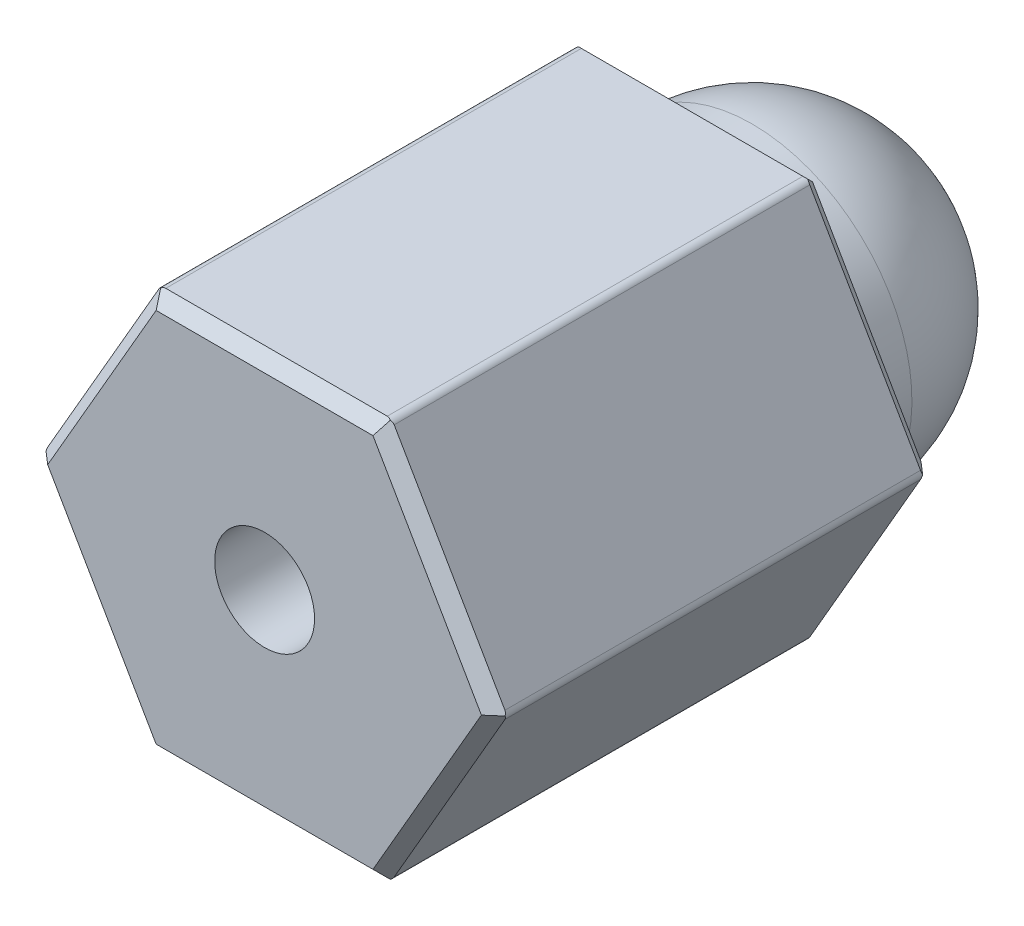
ISO-10303-21;
HEADER;
FILE_DESCRIPTION(('STEP AP214'),'2;1');
FILE_NAME('part.step','',(''),(''),'','','');
FILE_SCHEMA(('AUTOMOTIVE_DESIGN { 1 0 10303 214 1 1 1 1 }'));
ENDSEC;
DATA;
#1=APPLICATION_CONTEXT('core data for automotive mechanical design processes');
#2=APPLICATION_PROTOCOL_DEFINITION('international standard','automotive_design',2000,#1);
#3=PRODUCT_CONTEXT('',#1,'mechanical');
#4=PRODUCT('Part','Part','',(#3));
#5=PRODUCT_RELATED_PRODUCT_CATEGORY('part','',(#4));
#6=PRODUCT_DEFINITION_FORMATION('','',#4);
#7=PRODUCT_DEFINITION_CONTEXT('part definition',#1,'design');
#8=PRODUCT_DEFINITION('design','',#6,#7);
#9=PRODUCT_DEFINITION_SHAPE('','',#8);
#10=(LENGTH_UNIT() NAMED_UNIT(*) SI_UNIT(.MILLI.,.METRE.));
#11=(NAMED_UNIT(*) PLANE_ANGLE_UNIT() SI_UNIT($,.RADIAN.));
#12=(NAMED_UNIT(*) SI_UNIT($,.STERADIAN.) SOLID_ANGLE_UNIT());
#13=UNCERTAINTY_MEASURE_WITH_UNIT(LENGTH_MEASURE(1.E-05),#10,'distance_accuracy_value','');
#14=(GEOMETRIC_REPRESENTATION_CONTEXT(3) GLOBAL_UNCERTAINTY_ASSIGNED_CONTEXT((#13)) GLOBAL_UNIT_ASSIGNED_CONTEXT((#10,
#11,#12)) REPRESENTATION_CONTEXT('',''));
#15=CARTESIAN_POINT('',(0.,0.,0.));
#16=DIRECTION('',(0.,0.,1.));
#17=DIRECTION('',(1.,0.,0.));
#18=AXIS2_PLACEMENT_3D('',#15,#16,#17);
#19=CARTESIAN_POINT('',(-2.888502691896,-5.,-5.5));
#20=DIRECTION('',(0.,-1.,0.));
#21=DIRECTION('',(0.,0.,-1.));
#22=AXIS2_PLACEMENT_3D('',#19,#20,#21);
#23=PLANE('',#22);
#24=DIRECTION('',(1.,0.,0.));
#25=VECTOR('',#24,1.);
#26=CARTESIAN_POINT('',(-2.773032638058,-5.,5.2));
#27=LINE('',#26,#25);
#28=CARTESIAN_POINT('',(-2.773032638058,-5.,5.2));
#29=VERTEX_POINT('',#28);
#30=CARTESIAN_POINT('',(2.769529946162,-5.,5.2));
#31=VERTEX_POINT('',#30);
#32=EDGE_CURVE('E280',#29,#31,#27,.T.);
#33=ORIENTED_EDGE('',*,*,#32,.F.);
#34=DIRECTION('',(0.,0.,-1.));
#35=VECTOR('',#34,1.);
#36=CARTESIAN_POINT('',(-2.773032638058,-5.,5.2));
#37=LINE('',#36,#35);
#38=CARTESIAN_POINT('',(-2.773032638058,-5.,-5.2));
#39=VERTEX_POINT('',#38);
#40=EDGE_CURVE('E514',#29,#39,#37,.T.);
#41=ORIENTED_EDGE('',*,*,#40,.T.);
#42=DIRECTION('',(-1.,0.,0.));
#43=VECTOR('',#42,1.);
#44=CARTESIAN_POINT('',(2.769529946162,-5.,-5.2));
#45=LINE('',#44,#43);
#46=CARTESIAN_POINT('',(2.769529946162,-5.,-5.2));
#47=VERTEX_POINT('',#46);
#48=EDGE_CURVE('E353',#47,#39,#45,.T.);
#49=ORIENTED_EDGE('',*,*,#48,.F.);
#50=DIRECTION('',(0.,0.,-1.));
#51=VECTOR('',#50,1.);
#52=CARTESIAN_POINT('',(2.769529946162,-5.,5.2));
#53=LINE('',#52,#51);
#54=EDGE_CURVE('E284',#31,#47,#53,.T.);
#55=ORIENTED_EDGE('',*,*,#54,.F.);
#56=EDGE_LOOP('',(#33,#41,#49,#55));
#57=FACE_BOUND('',#56,.T.);
#58=ADVANCED_FACE('F17',(#57),#23,.T.);
#59=CARTESIAN_POINT('',(2.885,-5.,-5.5));
#60=DIRECTION('',(0.866025403784429,-0.500000000000017,0.));
#61=DIRECTION('',(0.,0.,-1.));
#62=AXIS2_PLACEMENT_3D('',#59,#60,#61);
#63=PLANE('',#62);
#64=DIRECTION('',(0.500000000000017,0.866025403784429,0.));
#65=VECTOR('',#64,1.);
#66=CARTESIAN_POINT('',(2.942735026919,-4.9,5.2));
#67=LINE('',#66,#65);
#68=CARTESIAN_POINT('',(2.942735026919,-4.9,5.2));
#69=VERTEX_POINT('',#68);
#70=CARTESIAN_POINT('',(5.714016319029,-0.1,5.2));
#71=VERTEX_POINT('',#70);
#72=EDGE_CURVE('E296',#69,#71,#67,.T.);
#73=ORIENTED_EDGE('',*,*,#72,.F.);
#74=DIRECTION('',(0.,0.,-1.));
#75=VECTOR('',#74,1.);
#76=CARTESIAN_POINT('',(2.942735026919,-4.9,5.2));
#77=LINE('',#76,#75);
#78=CARTESIAN_POINT('',(2.942735026919,-4.9,-5.2));
#79=VERTEX_POINT('',#78);
#80=EDGE_CURVE('E360',#69,#79,#77,.T.);
#81=ORIENTED_EDGE('',*,*,#80,.T.);
#82=DIRECTION('',(-0.500000000000017,-0.866025403784429,0.));
#83=VECTOR('',#82,1.);
#84=CARTESIAN_POINT('',(5.714016319029,-0.1,-5.2));
#85=LINE('',#84,#83);
#86=CARTESIAN_POINT('',(5.714016319029,-0.1,-5.2));
#87=VERTEX_POINT('',#86);
#88=EDGE_CURVE('E413',#87,#79,#85,.T.);
#89=ORIENTED_EDGE('',*,*,#88,.F.);
#90=DIRECTION('',(0.,0.,-1.));
#91=VECTOR('',#90,1.);
#92=CARTESIAN_POINT('',(5.714016319029,-0.1,5.2));
#93=LINE('',#92,#91);
#94=EDGE_CURVE('E292',#71,#87,#93,.T.);
#95=ORIENTED_EDGE('',*,*,#94,.F.);
#96=EDGE_LOOP('',(#73,#81,#89,#95));
#97=FACE_BOUND('',#96,.T.);
#98=ADVANCED_FACE('F977',(#97),#63,.T.);
#99=CARTESIAN_POINT('',(5.771751345948,0.,-5.5));
#100=DIRECTION('',(0.866025403784429,0.500000000000017,0.));
#101=DIRECTION('',(0.,0.,-1.));
#102=AXIS2_PLACEMENT_3D('',#99,#100,#101);
#103=PLANE('',#102);
#104=DIRECTION('',(-0.500000000000017,0.866025403784429,0.));
#105=VECTOR('',#104,1.);
#106=CARTESIAN_POINT('',(5.714016319029,0.1,5.2));
#107=LINE('',#106,#105);
#108=CARTESIAN_POINT('',(5.714016319029,0.1,5.2));
#109=VERTEX_POINT('',#108);
#110=CARTESIAN_POINT('',(2.942735026919,4.9,5.2));
#111=VERTEX_POINT('',#110);
#112=EDGE_CURVE('E233',#109,#111,#107,.T.);
#113=ORIENTED_EDGE('',*,*,#112,.F.);
#114=DIRECTION('',(0.,0.,-1.));
#115=VECTOR('',#114,1.);
#116=CARTESIAN_POINT('',(5.714016319029,0.1,5.2));
#117=LINE('',#116,#115);
#118=CARTESIAN_POINT('',(5.714016319029,0.1,-5.2));
#119=VERTEX_POINT('',#118);
#120=EDGE_CURVE('E237',#109,#119,#117,.T.);
#121=ORIENTED_EDGE('',*,*,#120,.T.);
#122=DIRECTION('',(0.500000000000017,-0.866025403784429,0.));
#123=VECTOR('',#122,1.);
#124=CARTESIAN_POINT('',(2.942735026919,4.9,-5.2));
#125=LINE('',#124,#123);
#126=CARTESIAN_POINT('',(2.942735026919,4.9,-5.2));
#127=VERTEX_POINT('',#126);
#128=EDGE_CURVE('E374',#127,#119,#125,.T.);
#129=ORIENTED_EDGE('',*,*,#128,.F.);
#130=DIRECTION('',(0.,0.,-1.));
#131=VECTOR('',#130,1.);
#132=CARTESIAN_POINT('',(2.942735026919,4.9,5.2));
#133=LINE('',#132,#131);
#134=EDGE_CURVE('E240',#111,#127,#133,.T.);
#135=ORIENTED_EDGE('',*,*,#134,.F.);
#136=EDGE_LOOP('',(#113,#121,#129,#135));
#137=FACE_BOUND('',#136,.T.);
#138=ADVANCED_FACE('F235',(#137),#103,.T.);
#139=CARTESIAN_POINT('',(-4.201974554303,2.425,-5.35));
#140=DIRECTION('',(-0.612372435695813,0.353553390593307,-0.707106781186515));
#141=DIRECTION('',(-0.75592894601843,0.,0.654653670708006));
#142=AXIS2_PLACEMENT_3D('',#139,#140,#141);
#143=PLANE('',#142);
#144=CARTESIAN_POINT('',(-2.773032638058,4.8,-5.40000000000051));
#145=DIRECTION('',(0.612372435695813,-0.353553390593307,0.707106781186515));
#146=DIRECTION('',(-0.612372435695759,0.353553390593269,0.70710678118658));
#147=AXIS2_PLACEMENT_3D('',#144,#145,#146);
#148=ELLIPSE('',#147,0.282842712474632,0.2);
#149=CARTESIAN_POINT('',(-2.873032638058,4.973205080757,-5.226794919243));
#150=VERTEX_POINT('',#149);
#151=CARTESIAN_POINT('',(-2.946237718815,4.9,-5.2));
#152=VERTEX_POINT('',#151);
#153=EDGE_CURVE('E275',#150,#152,#148,.T.);
#154=ORIENTED_EDGE('',*,*,#153,.F.);
#155=DIRECTION('',(0.377964473009193,-0.654653670707987,-0.654653670707987));
#156=VECTOR('',#155,1.);
#157=CARTESIAN_POINT('',(-2.873032638058,4.973205080757,-5.226794919243));
#158=LINE('',#157,#156);
#159=CARTESIAN_POINT('',(-2.715297611139,4.7,-5.5));
#160=VERTEX_POINT('',#159);
#161=EDGE_CURVE('E373',#150,#160,#158,.T.);
#162=ORIENTED_EDGE('',*,*,#161,.T.);
#163=DIRECTION('',(0.500000000000017,0.866025403784429,0.));
#164=VECTOR('',#163,1.);
#165=CARTESIAN_POINT('',(-5.428843876331,0.,-5.5));
#166=LINE('',#165,#164);
#167=CARTESIAN_POINT('',(-5.428843876331,0.,-5.5));
#168=VERTEX_POINT('',#167);
#169=EDGE_CURVE('E316',#168,#160,#166,.T.);
#170=ORIENTED_EDGE('',*,*,#169,.F.);
#171=DIRECTION('',(0.755928946018463,0.,-0.654653670707968));
#172=VECTOR('',#171,1.);
#173=CARTESIAN_POINT('',(-5.744313930169,0.,-5.226794919243));
#174=LINE('',#173,#172);
#175=CARTESIAN_POINT('',(-5.744313930169,0.,-5.226794919243));
#176=VERTEX_POINT('',#175);
#177=EDGE_CURVE('E383',#176,#168,#174,.T.);
#178=ORIENTED_EDGE('',*,*,#177,.F.);
#179=CARTESIAN_POINT('',(-5.544313930169,0.,-5.4));
#180=DIRECTION('',(0.612372435695813,-0.353553390593307,0.707106781186515));
#181=DIRECTION('',(-0.612372435695756,0.353553390593275,0.70710678118658));
#182=AXIS2_PLACEMENT_3D('',#179,#180,#181);
#183=ELLIPSE('',#182,0.282842712474632,0.2);
#184=CARTESIAN_POINT('',(-5.717519010925,0.1,-5.2));
#185=VERTEX_POINT('',#184);
#186=EDGE_CURVE('E466',#185,#176,#183,.T.);
#187=ORIENTED_EDGE('',*,*,#186,.F.);
#188=DIRECTION('',(0.500000000000017,0.866025403784429,0.));
#189=VECTOR('',#188,1.);
#190=CARTESIAN_POINT('',(-5.717519010925,0.1,-5.2));
#191=LINE('',#190,#189);
#192=EDGE_CURVE('E11',#185,#152,#191,.T.);
#193=ORIENTED_EDGE('',*,*,#192,.T.);
#194=EDGE_LOOP('',(#154,#162,#170,#178,#187,#193));
#195=FACE_BOUND('',#194,.T.);
#196=ADVANCED_FACE('F946',(#195),#143,.T.);
#197=CARTESIAN_POINT('',(-2.888502691896,5.,-5.5));
#198=DIRECTION('',(-0.866025403784429,0.500000000000017,0.));
#199=DIRECTION('',(0.,0.,1.));
#200=AXIS2_PLACEMENT_3D('',#197,#198,#199);
#201=PLANE('',#200);
#202=DIRECTION('',(-0.500000000000017,-0.866025403784429,0.));
#203=VECTOR('',#202,1.);
#204=CARTESIAN_POINT('',(-2.946237718815,4.9,5.2));
#205=LINE('',#204,#203);
#206=CARTESIAN_POINT('',(-2.946237718815,4.9,5.2));
#207=VERTEX_POINT('',#206);
#208=CARTESIAN_POINT('',(-5.717519010925,0.1,5.2));
#209=VERTEX_POINT('',#208);
#210=EDGE_CURVE('E433',#207,#209,#205,.T.);
#211=ORIENTED_EDGE('',*,*,#210,.F.);
#212=DIRECTION('',(0.,0.,-1.));
#213=VECTOR('',#212,1.);
#214=CARTESIAN_POINT('',(-2.946237718815,4.9,5.2));
#215=LINE('',#214,#213);
#216=EDGE_CURVE('E28',#207,#152,#215,.T.);
#217=ORIENTED_EDGE('',*,*,#216,.T.);
#218=ORIENTED_EDGE('',*,*,#192,.F.);
#219=DIRECTION('',(0.,0.,-1.));
#220=VECTOR('',#219,1.);
#221=CARTESIAN_POINT('',(-5.717519010925,0.1,5.2));
#222=LINE('',#221,#220);
#223=EDGE_CURVE('E442',#209,#185,#222,.T.);
#224=ORIENTED_EDGE('',*,*,#223,.F.);
#225=EDGE_LOOP('',(#211,#217,#218,#224));
#226=FACE_BOUND('',#225,.T.);
#227=ADVANCED_FACE('F877',(#226),#201,.T.);
#228=CARTESIAN_POINT('',(-2.773032638058,4.8,26.35717116565));
#229=DIRECTION('',(0.,0.,-1.));
#230=DIRECTION('',(-0.866025403784429,0.500000000000017,0.));
#231=AXIS2_PLACEMENT_3D('',#228,#229,#230);
#232=CYLINDRICAL_SURFACE('',#231,0.2);
#233=CARTESIAN_POINT('',(-2.773032638058,4.8,5.4));
#234=DIRECTION('',(0.,-0.707106781186548,-0.707106781186548));
#235=DIRECTION('',(0.,0.707106781186548,-0.707106781186548));
#236=AXIS2_PLACEMENT_3D('',#233,#234,#235);
#237=ELLIPSE('',#236,0.282842712474619,0.2);
#238=CARTESIAN_POINT('',(-2.873032638058,4.973205080757,5.226794919243));
#239=VERTEX_POINT('',#238);
#240=CARTESIAN_POINT('',(-2.773032638058,5.,5.2));
#241=VERTEX_POINT('',#240);
#242=EDGE_CURVE('E335',#239,#241,#237,.T.);
#243=ORIENTED_EDGE('',*,*,#242,.T.);
#244=DIRECTION('',(0.,0.,-1.));
#245=VECTOR('',#244,1.);
#246=CARTESIAN_POINT('',(-2.773032638058,5.,5.2));
#247=LINE('',#246,#245);
#248=CARTESIAN_POINT('',(-2.773032638058,5.,-5.2));
#249=VERTEX_POINT('',#248);
#250=EDGE_CURVE('E279',#241,#249,#247,.T.);
#251=ORIENTED_EDGE('',*,*,#250,.T.);
#252=CARTESIAN_POINT('',(-2.773032638058,4.8,-5.4));
#253=DIRECTION('',(0.,-0.707106781186548,0.707106781186548));
#254=DIRECTION('',(0.,0.707106781186548,0.707106781186548));
#255=AXIS2_PLACEMENT_3D('',#252,#253,#254);
#256=ELLIPSE('',#255,0.282842712474619,0.2);
#257=EDGE_CURVE('E339',#249,#150,#256,.T.);
#258=ORIENTED_EDGE('',*,*,#257,.T.);
#259=ORIENTED_EDGE('',*,*,#153,.T.);
#260=ORIENTED_EDGE('',*,*,#216,.F.);
#261=CARTESIAN_POINT('',(-2.773032638058,4.8,5.40000000000052));
#262=DIRECTION('',(0.612372435695813,-0.353553390593307,-0.707106781186515));
#263=DIRECTION('',(-0.612372435695759,0.353553390593269,-0.70710678118658));
#264=AXIS2_PLACEMENT_3D('',#261,#262,#263);
#265=ELLIPSE('',#264,0.282842712474632,0.2);
#266=EDGE_CURVE('E431',#207,#239,#265,.T.);
#267=ORIENTED_EDGE('',*,*,#266,.T.);
#268=EDGE_LOOP('',(#243,#251,#258,#259,#260,#267));
#269=FACE_BOUND('',#268,.T.);
#270=ADVANCED_FACE('F871',(#269),#232,.T.);
#271=CARTESIAN_POINT('',(2.885,5.,-5.5));
#272=DIRECTION('',(0.,1.,0.));
#273=DIRECTION('',(1.,0.,0.));
#274=AXIS2_PLACEMENT_3D('',#271,#272,#273);
#275=PLANE('',#274);
#276=DIRECTION('',(-1.,0.,0.));
#277=VECTOR('',#276,1.);
#278=CARTESIAN_POINT('',(2.769529946162,5.,5.2));
#279=LINE('',#278,#277);
#280=CARTESIAN_POINT('',(2.769529946162,5.,5.2));
#281=VERTEX_POINT('',#280);
#282=EDGE_CURVE('E331',#281,#241,#279,.T.);
#283=ORIENTED_EDGE('',*,*,#282,.F.);
#284=DIRECTION('',(0.,0.,-1.));
#285=VECTOR('',#284,1.);
#286=CARTESIAN_POINT('',(2.769529946162,5.,5.2));
#287=LINE('',#286,#285);
#288=CARTESIAN_POINT('',(2.769529946162,5.,-5.2));
#289=VERTEX_POINT('',#288);
#290=EDGE_CURVE('E310',#281,#289,#287,.T.);
#291=ORIENTED_EDGE('',*,*,#290,.T.);
#292=DIRECTION('',(1.,0.,0.));
#293=VECTOR('',#292,1.);
#294=CARTESIAN_POINT('',(-2.773032638058,5.,-5.2));
#295=LINE('',#294,#293);
#296=EDGE_CURVE('E336',#249,#289,#295,.T.);
#297=ORIENTED_EDGE('',*,*,#296,.F.);
#298=ORIENTED_EDGE('',*,*,#250,.F.);
#299=EDGE_LOOP('',(#283,#291,#297,#298));
#300=FACE_BOUND('',#299,.T.);
#301=ADVANCED_FACE('F876',(#300),#275,.T.);
#302=CARTESIAN_POINT('',(-0.001751345948136,4.85,-5.35));
#303=DIRECTION('',(0.,0.707106781186548,-0.707106781186548));
#304=DIRECTION('',(-1.,0.,0.));
#305=AXIS2_PLACEMENT_3D('',#302,#303,#304);
#306=PLANE('',#305);
#307=CARTESIAN_POINT('',(2.769529946162,4.8,-5.4));
#308=DIRECTION('',(0.,-0.707106781186548,0.707106781186548));
#309=DIRECTION('',(0.,0.707106781186548,0.707106781186548));
#310=AXIS2_PLACEMENT_3D('',#307,#308,#309);
#311=ELLIPSE('',#310,0.282842712474619,0.2);
#312=CARTESIAN_POINT('',(2.869529946162,4.973205080757,-5.226794919243));
#313=VERTEX_POINT('',#312);
#314=EDGE_CURVE('E306',#313,#289,#311,.T.);
#315=ORIENTED_EDGE('',*,*,#314,.F.);
#316=DIRECTION('',(-0.377964473009193,-0.654653670707987,-0.654653670707987));
#317=VECTOR('',#316,1.);
#318=CARTESIAN_POINT('',(2.869529946162,4.973205080757,-5.226794919243));
#319=LINE('',#318,#317);
#320=CARTESIAN_POINT('',(2.711794919243,4.7,-5.5));
#321=VERTEX_POINT('',#320);
#322=EDGE_CURVE('E370',#313,#321,#319,.T.);
#323=ORIENTED_EDGE('',*,*,#322,.T.);
#324=DIRECTION('',(1.,0.,0.));
#325=VECTOR('',#324,1.);
#326=CARTESIAN_POINT('',(-2.715297611139,4.7,-5.5));
#327=LINE('',#326,#325);
#328=EDGE_CURVE('E379',#160,#321,#327,.T.);
#329=ORIENTED_EDGE('',*,*,#328,.F.);
#330=ORIENTED_EDGE('',*,*,#161,.F.);
#331=ORIENTED_EDGE('',*,*,#257,.F.);
#332=ORIENTED_EDGE('',*,*,#296,.T.);
#333=EDGE_LOOP('',(#315,#323,#329,#330,#331,#332));
#334=FACE_BOUND('',#333,.T.);
#335=ADVANCED_FACE('F845',(#334),#306,.T.);
#336=CARTESIAN_POINT('',(4.198471862406,2.425,-5.35));
#337=DIRECTION('',(0.612372435695813,0.353553390593307,-0.707106781186515));
#338=DIRECTION('',(0.,-0.894427190999891,-0.447213595500008));
#339=AXIS2_PLACEMENT_3D('',#336,#337,#338);
#340=PLANE('',#339);
#341=CARTESIAN_POINT('',(2.769529946162,4.8,-5.39999999999964));
#342=DIRECTION('',(-0.612372435695813,-0.353553390593307,0.707106781186515));
#343=DIRECTION('',(0.612372435695756,0.353553390593275,0.70710678118658));
#344=AXIS2_PLACEMENT_3D('',#341,#342,#343);
#345=ELLIPSE('',#344,0.282842712474632,0.2);
#346=EDGE_CURVE('E311',#127,#313,#345,.T.);
#347=ORIENTED_EDGE('',*,*,#346,.F.);
#348=ORIENTED_EDGE('',*,*,#128,.T.);
#349=CARTESIAN_POINT('',(5.540811238272,0.,-5.4));
#350=DIRECTION('',(-0.612372435695813,-0.353553390593307,0.707106781186515));
#351=DIRECTION('',(0.612372435695759,0.353553390593269,0.70710678118658));
#352=AXIS2_PLACEMENT_3D('',#349,#350,#351);
#353=ELLIPSE('',#352,0.282842712474632,0.2);
#354=CARTESIAN_POINT('',(5.740811238272,0.,-5.226794919243));
#355=VERTEX_POINT('',#354);
#356=EDGE_CURVE('E262',#355,#119,#353,.T.);
#357=ORIENTED_EDGE('',*,*,#356,.F.);
#358=DIRECTION('',(-0.755928946018463,0.,-0.654653670707968));
#359=VECTOR('',#358,1.);
#360=CARTESIAN_POINT('',(5.740811238272,0.,-5.226794919243));
#361=LINE('',#360,#359);
#362=CARTESIAN_POINT('',(5.425341184434,0.,-5.5));
#363=VERTEX_POINT('',#362);
#364=EDGE_CURVE('E471',#355,#363,#361,.T.);
#365=ORIENTED_EDGE('',*,*,#364,.T.);
#366=DIRECTION('',(0.500000000000017,-0.866025403784429,0.));
#367=VECTOR('',#366,1.);
#368=CARTESIAN_POINT('',(2.711794919243,4.7,-5.5));
#369=LINE('',#368,#367);
#370=EDGE_CURVE('E375',#321,#363,#369,.T.);
#371=ORIENTED_EDGE('',*,*,#370,.F.);
#372=ORIENTED_EDGE('',*,*,#322,.F.);
#373=EDGE_LOOP('',(#347,#348,#357,#365,#371,#372));
#374=FACE_BOUND('',#373,.T.);
#375=ADVANCED_FACE('F839',(#374),#340,.T.);
#376=CARTESIAN_POINT('',(4.198471862406,-2.425,-5.35));
#377=DIRECTION('',(0.612372435695813,-0.353553390593307,-0.707106781186515));
#378=DIRECTION('',(0.,-0.894427190999891,0.447213595500008));
#379=AXIS2_PLACEMENT_3D('',#376,#377,#378);
#380=PLANE('',#379);
#381=CARTESIAN_POINT('',(5.540811238272,0.,-5.4));
#382=DIRECTION('',(-0.612372435695813,0.353553390593307,0.707106781186515));
#383=DIRECTION('',(0.612372435695756,-0.353553390593275,0.70710678118658));
#384=AXIS2_PLACEMENT_3D('',#381,#382,#383);
#385=ELLIPSE('',#384,0.282842712474632,0.2);
#386=EDGE_CURVE('E269',#87,#355,#385,.T.);
#387=ORIENTED_EDGE('',*,*,#386,.F.);
#388=ORIENTED_EDGE('',*,*,#88,.T.);
#389=CARTESIAN_POINT('',(2.769529946162,-4.8,-5.39999999999964));
#390=DIRECTION('',(-0.612372435695813,0.353553390593307,0.707106781186515));
#391=DIRECTION('',(0.612372435695759,-0.353553390593269,0.70710678118658));
#392=AXIS2_PLACEMENT_3D('',#389,#390,#391);
#393=ELLIPSE('',#392,0.282842712474632,0.2);
#394=CARTESIAN_POINT('',(2.869529946162,-4.973205080757,-5.226794919243));
#395=VERTEX_POINT('',#394);
#396=EDGE_CURVE('E407',#395,#79,#393,.T.);
#397=ORIENTED_EDGE('',*,*,#396,.F.);
#398=DIRECTION('',(-0.377964473009193,0.654653670707987,-0.654653670707987));
#399=VECTOR('',#398,1.);
#400=CARTESIAN_POINT('',(2.869529946162,-4.973205080757,-5.226794919243));
#401=LINE('',#400,#399);
#402=CARTESIAN_POINT('',(2.711794919243,-4.7,-5.5));
#403=VERTEX_POINT('',#402);
#404=EDGE_CURVE('E356',#395,#403,#401,.T.);
#405=ORIENTED_EDGE('',*,*,#404,.T.);
#406=DIRECTION('',(-0.500000000000017,-0.866025403784429,0.));
#407=VECTOR('',#406,1.);
#408=CARTESIAN_POINT('',(5.425341184434,0.,-5.5));
#409=LINE('',#408,#407);
#410=EDGE_CURVE('E378',#363,#403,#409,.T.);
#411=ORIENTED_EDGE('',*,*,#410,.F.);
#412=ORIENTED_EDGE('',*,*,#364,.F.);
#413=EDGE_LOOP('',(#387,#388,#397,#405,#411,#412));
#414=FACE_BOUND('',#413,.T.);
#415=ADVANCED_FACE('F844',(#414),#380,.T.);
#416=CARTESIAN_POINT('',(-0.001751345948124,-4.85,-5.35));
#417=DIRECTION('',(0.,-0.707106781186548,-0.707106781186548));
#418=DIRECTION('',(0.,-0.707106781186548,0.707106781186548));
#419=AXIS2_PLACEMENT_3D('',#416,#417,#418);
#420=PLANE('',#419);
#421=CARTESIAN_POINT('',(2.769529946162,-4.8,-5.4));
#422=DIRECTION('',(0.,0.707106781186548,0.707106781186548));
#423=DIRECTION('',(0.,-0.707106781186548,0.707106781186548));
#424=AXIS2_PLACEMENT_3D('',#421,#422,#423);
#425=ELLIPSE('',#424,0.282842712474619,0.2);
#426=EDGE_CURVE('E394',#47,#395,#425,.T.);
#427=ORIENTED_EDGE('',*,*,#426,.F.);
#428=ORIENTED_EDGE('',*,*,#48,.T.);
#429=CARTESIAN_POINT('',(-2.773032638058,-4.8,-5.4));
#430=DIRECTION('',(0.,0.707106781186548,0.707106781186548));
#431=DIRECTION('',(0.,-0.707106781186548,0.707106781186548));
#432=AXIS2_PLACEMENT_3D('',#429,#430,#431);
#433=ELLIPSE('',#432,0.282842712474619,0.2);
#434=CARTESIAN_POINT('',(-2.873032638058,-4.973205080757,-5.226794919243));
#435=VERTEX_POINT('',#434);
#436=EDGE_CURVE('E486',#435,#39,#433,.T.);
#437=ORIENTED_EDGE('',*,*,#436,.F.);
#438=DIRECTION('',(0.377964473009193,0.654653670707987,-0.654653670707987));
#439=VECTOR('',#438,1.);
#440=CARTESIAN_POINT('',(-2.873032638058,-4.973205080757,-5.226794919243));
#441=LINE('',#440,#439);
#442=CARTESIAN_POINT('',(-2.715297611139,-4.7,-5.5));
#443=VERTEX_POINT('',#442);
#444=EDGE_CURVE('E357',#435,#443,#441,.T.);
#445=ORIENTED_EDGE('',*,*,#444,.T.);
#446=DIRECTION('',(-1.,0.,0.));
#447=VECTOR('',#446,1.);
#448=CARTESIAN_POINT('',(2.711794919243,-4.7,-5.5));
#449=LINE('',#448,#447);
#450=EDGE_CURVE('E317',#403,#443,#449,.T.);
#451=ORIENTED_EDGE('',*,*,#450,.F.);
#452=ORIENTED_EDGE('',*,*,#404,.F.);
#453=EDGE_LOOP('',(#427,#428,#437,#445,#451,#452));
#454=FACE_BOUND('',#453,.T.);
#455=ADVANCED_FACE('F901',(#454),#420,.T.);
#456=CARTESIAN_POINT('',(-4.201974554303,-2.425,-5.35));
#457=DIRECTION('',(-0.612372435695813,-0.353553390593307,-0.707106781186515));
#458=DIRECTION('',(-0.75592894601843,0.,0.654653670708006));
#459=AXIS2_PLACEMENT_3D('',#456,#457,#458);
#460=PLANE('',#459);
#461=CARTESIAN_POINT('',(-2.773032638058,-4.8,-5.40000000000051));
#462=DIRECTION('',(0.612372435695813,0.353553390593307,0.707106781186515));
#463=DIRECTION('',(-0.612372435695756,-0.353553390593275,0.70710678118658));
#464=AXIS2_PLACEMENT_3D('',#461,#462,#463);
#465=ELLIPSE('',#464,0.282842712474632,0.2);
#466=CARTESIAN_POINT('',(-2.946237718815,-4.9,-5.2));
#467=VERTEX_POINT('',#466);
#468=EDGE_CURVE('E405',#467,#435,#465,.T.);
#469=ORIENTED_EDGE('',*,*,#468,.F.);
#470=DIRECTION('',(-0.500000000000017,0.866025403784429,0.));
#471=VECTOR('',#470,1.);
#472=CARTESIAN_POINT('',(-2.946237718815,-4.9,-5.2));
#473=LINE('',#472,#471);
#474=CARTESIAN_POINT('',(-5.717519010925,-0.1,-5.2));
#475=VERTEX_POINT('',#474);
#476=EDGE_CURVE('E304',#467,#475,#473,.T.);
#477=ORIENTED_EDGE('',*,*,#476,.T.);
#478=CARTESIAN_POINT('',(-5.544313930169,0.,-5.4));
#479=DIRECTION('',(0.612372435695813,0.353553390593307,0.707106781186515));
#480=DIRECTION('',(-0.612372435695759,-0.353553390593269,0.70710678118658));
#481=AXIS2_PLACEMENT_3D('',#478,#479,#480);
#482=ELLIPSE('',#481,0.282842712474632,0.2);
#483=EDGE_CURVE('E305',#176,#475,#482,.T.);
#484=ORIENTED_EDGE('',*,*,#483,.F.);
#485=ORIENTED_EDGE('',*,*,#177,.T.);
#486=DIRECTION('',(-0.500000000000017,0.866025403784429,0.));
#487=VECTOR('',#486,1.);
#488=CARTESIAN_POINT('',(-2.715297611139,-4.7,-5.5));
#489=LINE('',#488,#487);
#490=EDGE_CURVE('E312',#443,#168,#489,.T.);
#491=ORIENTED_EDGE('',*,*,#490,.F.);
#492=ORIENTED_EDGE('',*,*,#444,.F.);
#493=EDGE_LOOP('',(#469,#477,#484,#485,#491,#492));
#494=FACE_BOUND('',#493,.T.);
#495=ADVANCED_FACE('F19',(#494),#460,.T.);
#496=CARTESIAN_POINT('',(-5.775254037844,0.,-5.5));
#497=DIRECTION('',(-0.866025403784429,-0.500000000000017,0.));
#498=DIRECTION('',(-0.500000000000017,0.866025403784429,0.));
#499=AXIS2_PLACEMENT_3D('',#496,#497,#498);
#500=PLANE('',#499);
#501=DIRECTION('',(0.500000000000017,-0.866025403784429,0.));
#502=VECTOR('',#501,1.);
#503=CARTESIAN_POINT('',(-5.717519010925,-0.1,5.2));
#504=LINE('',#503,#502);
#505=CARTESIAN_POINT('',(-5.717519010925,-0.1,5.2));
#506=VERTEX_POINT('',#505);
#507=CARTESIAN_POINT('',(-2.946237718815,-4.9,5.2));
#508=VERTEX_POINT('',#507);
#509=EDGE_CURVE('E406',#506,#508,#504,.T.);
#510=ORIENTED_EDGE('',*,*,#509,.F.);
#511=DIRECTION('',(0.,0.,-1.));
#512=VECTOR('',#511,1.);
#513=CARTESIAN_POINT('',(-5.717519010925,-0.1,5.2));
#514=LINE('',#513,#512);
#515=EDGE_CURVE('E300',#506,#475,#514,.T.);
#516=ORIENTED_EDGE('',*,*,#515,.T.);
#517=ORIENTED_EDGE('',*,*,#476,.F.);
#518=DIRECTION('',(0.,0.,-1.));
#519=VECTOR('',#518,1.);
#520=CARTESIAN_POINT('',(-2.946237718815,-4.9,5.2));
#521=LINE('',#520,#519);
#522=EDGE_CURVE('E401',#508,#467,#521,.T.);
#523=ORIENTED_EDGE('',*,*,#522,.F.);
#524=EDGE_LOOP('',(#510,#516,#517,#523));
#525=FACE_BOUND('',#524,.T.);
#526=ADVANCED_FACE('F922',(#525),#500,.T.);
#527=CARTESIAN_POINT('',(-5.544313930169,0.,26.35717116565));
#528=DIRECTION('',(0.,0.,-1.));
#529=DIRECTION('',(-0.866025403784429,-0.500000000000017,0.));
#530=AXIS2_PLACEMENT_3D('',#527,#528,#529);
#531=CYLINDRICAL_SURFACE('',#530,0.2);
#532=CARTESIAN_POINT('',(-5.544313930169,0.,5.4));
#533=DIRECTION('',(0.612372435695813,0.353553390593307,-0.707106781186515));
#534=DIRECTION('',(-0.612372435695759,-0.353553390593269,-0.70710678118658));
#535=AXIS2_PLACEMENT_3D('',#532,#533,#534);
#536=ELLIPSE('',#535,0.282842712474632,0.2);
#537=CARTESIAN_POINT('',(-5.744313930169,0.,5.226794919243));
#538=VERTEX_POINT('',#537);
#539=EDGE_CURVE('E329',#506,#538,#536,.T.);
#540=ORIENTED_EDGE('',*,*,#539,.T.);
#541=CARTESIAN_POINT('',(-5.544313930169,0.,5.4));
#542=DIRECTION('',(0.612372435695813,-0.353553390593307,-0.707106781186515));
#543=DIRECTION('',(-0.612372435695756,0.353553390593275,-0.70710678118658));
#544=AXIS2_PLACEMENT_3D('',#541,#542,#543);
#545=ELLIPSE('',#544,0.282842712474632,0.2);
#546=EDGE_CURVE('E400',#538,#209,#545,.T.);
#547=ORIENTED_EDGE('',*,*,#546,.T.);
#548=ORIENTED_EDGE('',*,*,#223,.T.);
#549=ORIENTED_EDGE('',*,*,#186,.T.);
#550=ORIENTED_EDGE('',*,*,#483,.T.);
#551=ORIENTED_EDGE('',*,*,#515,.F.);
#552=EDGE_LOOP('',(#540,#547,#548,#549,#550,#551));
#553=FACE_BOUND('',#552,.T.);
#554=ADVANCED_FACE('F927',(#553),#531,.T.);
#555=CARTESIAN_POINT('',(-4.201974554303,2.425,5.35));
#556=DIRECTION('',(-0.612372435695813,0.353553390593307,0.707106781186515));
#557=DIRECTION('',(0.500000000000024,0.866025403784425,0.));
#558=AXIS2_PLACEMENT_3D('',#555,#556,#557);
#559=PLANE('',#558);
#560=ORIENTED_EDGE('',*,*,#546,.F.);
#561=DIRECTION('',(0.755928946018463,0.,0.654653670707968));
#562=VECTOR('',#561,1.);
#563=CARTESIAN_POINT('',(-5.744313930169,0.,5.226794919243));
#564=LINE('',#563,#562);
#565=CARTESIAN_POINT('',(-5.428843876331,0.,5.5));
#566=VERTEX_POINT('',#565);
#567=EDGE_CURVE('E326',#538,#566,#564,.T.);
#568=ORIENTED_EDGE('',*,*,#567,.T.);
#569=DIRECTION('',(-0.500000000000017,-0.866025403784429,0.));
#570=VECTOR('',#569,1.);
#571=CARTESIAN_POINT('',(-2.715297611139,4.7,5.5));
#572=LINE('',#571,#570);
#573=CARTESIAN_POINT('',(-2.715297611139,4.7,5.5));
#574=VERTEX_POINT('',#573);
#575=EDGE_CURVE('E347',#574,#566,#572,.T.);
#576=ORIENTED_EDGE('',*,*,#575,.F.);
#577=DIRECTION('',(0.377964473009193,-0.654653670707987,0.654653670707987));
#578=VECTOR('',#577,1.);
#579=CARTESIAN_POINT('',(-2.873032638058,4.973205080757,5.226794919243));
#580=LINE('',#579,#578);
#581=EDGE_CURVE('E366',#239,#574,#580,.T.);
#582=ORIENTED_EDGE('',*,*,#581,.F.);
#583=ORIENTED_EDGE('',*,*,#266,.F.);
#584=ORIENTED_EDGE('',*,*,#210,.T.);
#585=EDGE_LOOP('',(#560,#568,#576,#582,#583,#584));
#586=FACE_BOUND('',#585,.T.);
#587=ADVANCED_FACE('F888',(#586),#559,.T.);
#588=CARTESIAN_POINT('',(-0.001751345948119,4.85,5.35));
#589=DIRECTION('',(0.,0.707106781186548,0.707106781186548));
#590=DIRECTION('',(1.,0.,0.));
#591=AXIS2_PLACEMENT_3D('',#588,#589,#590);
#592=PLANE('',#591);
#593=CARTESIAN_POINT('',(2.769529946162,4.8,5.4));
#594=DIRECTION('',(0.,-0.707106781186548,-0.707106781186548));
#595=DIRECTION('',(0.,0.707106781186548,-0.707106781186548));
#596=AXIS2_PLACEMENT_3D('',#593,#594,#595);
#597=ELLIPSE('',#596,0.282842712474619,0.2);
#598=CARTESIAN_POINT('',(2.869529946162,4.973205080757,5.226794919243));
#599=VERTEX_POINT('',#598);
#600=EDGE_CURVE('E21',#281,#599,#597,.T.);
#601=ORIENTED_EDGE('',*,*,#600,.F.);
#602=ORIENTED_EDGE('',*,*,#282,.T.);
#603=ORIENTED_EDGE('',*,*,#242,.F.);
#604=ORIENTED_EDGE('',*,*,#581,.T.);
#605=DIRECTION('',(-1.,0.,0.));
#606=VECTOR('',#605,1.);
#607=CARTESIAN_POINT('',(2.711794919243,4.7,5.5));
#608=LINE('',#607,#606);
#609=CARTESIAN_POINT('',(2.711794919243,4.7,5.5));
#610=VERTEX_POINT('',#609);
#611=EDGE_CURVE('E343',#610,#574,#608,.T.);
#612=ORIENTED_EDGE('',*,*,#611,.F.);
#613=DIRECTION('',(-0.377964473009193,-0.654653670707987,0.654653670707987));
#614=VECTOR('',#613,1.);
#615=CARTESIAN_POINT('',(2.869529946162,4.973205080757,5.226794919243));
#616=LINE('',#615,#614);
#617=EDGE_CURVE('E245',#599,#610,#616,.T.);
#618=ORIENTED_EDGE('',*,*,#617,.F.);
#619=EDGE_LOOP('',(#601,#602,#603,#604,#612,#618));
#620=FACE_BOUND('',#619,.T.);
#621=ADVANCED_FACE('F883',(#620),#592,.T.);
#622=CARTESIAN_POINT('',(2.769529946162,4.8,26.35717116565));
#623=DIRECTION('',(0.,0.,-1.));
#624=DIRECTION('',(0.,1.,0.));
#625=AXIS2_PLACEMENT_3D('',#622,#623,#624);
#626=CYLINDRICAL_SURFACE('',#625,0.2);
#627=CARTESIAN_POINT('',(2.769529946162,4.8,5.39999999999965));
#628=DIRECTION('',(-0.612372435695813,-0.353553390593307,-0.707106781186515));
#629=DIRECTION('',(0.612372435695756,0.353553390593275,-0.70710678118658));
#630=AXIS2_PLACEMENT_3D('',#627,#628,#629);
#631=ELLIPSE('',#630,0.282842712474632,0.2);
#632=EDGE_CURVE('E257',#599,#111,#631,.T.);
#633=ORIENTED_EDGE('',*,*,#632,.T.);
#634=ORIENTED_EDGE('',*,*,#134,.T.);
#635=ORIENTED_EDGE('',*,*,#346,.T.);
#636=ORIENTED_EDGE('',*,*,#314,.T.);
#637=ORIENTED_EDGE('',*,*,#290,.F.);
#638=ORIENTED_EDGE('',*,*,#600,.T.);
#639=EDGE_LOOP('',(#633,#634,#635,#636,#637,#638));
#640=FACE_BOUND('',#639,.T.);
#641=ADVANCED_FACE('F856',(#640),#626,.T.);
#642=CARTESIAN_POINT('',(4.198471862406,2.425,5.35));
#643=DIRECTION('',(0.612372435695813,0.353553390593307,0.707106781186515));
#644=DIRECTION('',(0.500000000000024,-0.866025403784425,0.));
#645=AXIS2_PLACEMENT_3D('',#642,#643,#644);
#646=PLANE('',#645);
#647=ORIENTED_EDGE('',*,*,#632,.F.);
#648=ORIENTED_EDGE('',*,*,#617,.T.);
#649=DIRECTION('',(-0.500000000000017,0.866025403784429,0.));
#650=VECTOR('',#649,1.);
#651=CARTESIAN_POINT('',(5.425341184434,0.,5.5));
#652=LINE('',#651,#650);
#653=CARTESIAN_POINT('',(5.425341184434,0.,5.5));
#654=VERTEX_POINT('',#653);
#655=EDGE_CURVE('E348',#654,#610,#652,.T.);
#656=ORIENTED_EDGE('',*,*,#655,.F.);
#657=DIRECTION('',(-0.755928946018463,0.,0.654653670707968));
#658=VECTOR('',#657,1.);
#659=CARTESIAN_POINT('',(5.740811238272,0.,5.226794919243));
#660=LINE('',#659,#658);
#661=CARTESIAN_POINT('',(5.740811238272,0.,5.226794919243));
#662=VERTEX_POINT('',#661);
#663=EDGE_CURVE('E252',#662,#654,#660,.T.);
#664=ORIENTED_EDGE('',*,*,#663,.F.);
#665=CARTESIAN_POINT('',(5.540811238272,0.,5.4));
#666=DIRECTION('',(-0.612372435695813,-0.353553390593307,-0.707106781186515));
#667=DIRECTION('',(0.612372435695759,0.353553390593269,-0.70710678118658));
#668=AXIS2_PLACEMENT_3D('',#665,#666,#667);
#669=ELLIPSE('',#668,0.282842712474632,0.2);
#670=EDGE_CURVE('E248',#109,#662,#669,.T.);
#671=ORIENTED_EDGE('',*,*,#670,.F.);
#672=ORIENTED_EDGE('',*,*,#112,.T.);
#673=EDGE_LOOP('',(#647,#648,#656,#664,#671,#672));
#674=FACE_BOUND('',#673,.T.);
#675=ADVANCED_FACE('F249',(#674),#646,.T.);
#676=CARTESIAN_POINT('',(5.540811238272,0.,26.35717116565));
#677=DIRECTION('',(0.,0.,-1.));
#678=DIRECTION('',(0.866025403784429,0.500000000000017,0.));
#679=AXIS2_PLACEMENT_3D('',#676,#677,#678);
#680=CYLINDRICAL_SURFACE('',#679,0.2);
#681=CARTESIAN_POINT('',(5.540811238272,0.,5.4));
#682=DIRECTION('',(-0.612372435695813,0.353553390593307,-0.707106781186515));
#683=DIRECTION('',(0.612372435695756,-0.353553390593275,-0.70710678118658));
#684=AXIS2_PLACEMENT_3D('',#681,#682,#683);
#685=ELLIPSE('',#684,0.282842712474632,0.2);
#686=EDGE_CURVE('E318',#662,#71,#685,.T.);
#687=ORIENTED_EDGE('',*,*,#686,.T.);
#688=ORIENTED_EDGE('',*,*,#94,.T.);
#689=ORIENTED_EDGE('',*,*,#386,.T.);
#690=ORIENTED_EDGE('',*,*,#356,.T.);
#691=ORIENTED_EDGE('',*,*,#120,.F.);
#692=ORIENTED_EDGE('',*,*,#670,.T.);
#693=EDGE_LOOP('',(#687,#688,#689,#690,#691,#692));
#694=FACE_BOUND('',#693,.T.);
#695=ADVANCED_FACE('F259',(#694),#680,.T.);
#696=CARTESIAN_POINT('',(4.198471862406,-2.425,5.35));
#697=DIRECTION('',(0.612372435695813,-0.353553390593307,0.707106781186515));
#698=DIRECTION('',(-0.500000000000024,-0.866025403784425,0.));
#699=AXIS2_PLACEMENT_3D('',#696,#697,#698);
#700=PLANE('',#699);
#701=ORIENTED_EDGE('',*,*,#686,.F.);
#702=ORIENTED_EDGE('',*,*,#663,.T.);
#703=DIRECTION('',(0.500000000000017,0.866025403784429,0.));
#704=VECTOR('',#703,1.);
#705=CARTESIAN_POINT('',(2.711794919243,-4.7,5.5));
#706=LINE('',#705,#704);
#707=CARTESIAN_POINT('',(2.711794919243,-4.7,5.5));
#708=VERTEX_POINT('',#707);
#709=EDGE_CURVE('E352',#708,#654,#706,.T.);
#710=ORIENTED_EDGE('',*,*,#709,.F.);
#711=DIRECTION('',(-0.377964473009193,0.654653670707987,0.654653670707987));
#712=VECTOR('',#711,1.);
#713=CARTESIAN_POINT('',(2.869529946162,-4.973205080757,5.226794919243));
#714=LINE('',#713,#712);
#715=CARTESIAN_POINT('',(2.869529946162,-4.973205080757,5.226794919243));
#716=VERTEX_POINT('',#715);
#717=EDGE_CURVE('E285',#716,#708,#714,.T.);
#718=ORIENTED_EDGE('',*,*,#717,.F.);
#719=CARTESIAN_POINT('',(2.769529946162,-4.8,5.39999999999965));
#720=DIRECTION('',(-0.612372435695813,0.353553390593307,-0.707106781186515));
#721=DIRECTION('',(0.612372435695759,-0.353553390593269,-0.70710678118658));
#722=AXIS2_PLACEMENT_3D('',#719,#720,#721);
#723=ELLIPSE('',#722,0.282842712474632,0.2);
#724=EDGE_CURVE('E321',#69,#716,#723,.T.);
#725=ORIENTED_EDGE('',*,*,#724,.F.);
#726=ORIENTED_EDGE('',*,*,#72,.T.);
#727=EDGE_LOOP('',(#701,#702,#710,#718,#725,#726));
#728=FACE_BOUND('',#727,.T.);
#729=ADVANCED_FACE('F932',(#728),#700,.T.);
#730=CARTESIAN_POINT('',(2.769529946162,-4.8,26.35717116565));
#731=DIRECTION('',(0.,0.,-1.));
#732=DIRECTION('',(0.866025403784429,-0.500000000000017,0.));
#733=AXIS2_PLACEMENT_3D('',#730,#731,#732);
#734=CYLINDRICAL_SURFACE('',#733,0.2);
#735=CARTESIAN_POINT('',(2.769529946162,-4.8,5.4));
#736=DIRECTION('',(0.,0.707106781186548,-0.707106781186548));
#737=DIRECTION('',(0.,-0.707106781186548,-0.707106781186548));
#738=AXIS2_PLACEMENT_3D('',#735,#736,#737);
#739=ELLIPSE('',#738,0.282842712474619,0.2);
#740=EDGE_CURVE('E369',#716,#31,#739,.T.);
#741=ORIENTED_EDGE('',*,*,#740,.T.);
#742=ORIENTED_EDGE('',*,*,#54,.T.);
#743=ORIENTED_EDGE('',*,*,#426,.T.);
#744=ORIENTED_EDGE('',*,*,#396,.T.);
#745=ORIENTED_EDGE('',*,*,#80,.F.);
#746=ORIENTED_EDGE('',*,*,#724,.T.);
#747=EDGE_LOOP('',(#741,#742,#743,#744,#745,#746));
#748=FACE_BOUND('',#747,.T.);
#749=ADVANCED_FACE('F937',(#748),#734,.T.);
#750=CARTESIAN_POINT('',(-0.001751345948115,-4.85,5.35));
#751=DIRECTION('',(0.,-0.707106781186548,0.707106781186548));
#752=DIRECTION('',(-1.,0.,0.));
#753=AXIS2_PLACEMENT_3D('',#750,#751,#752);
#754=PLANE('',#753);
#755=ORIENTED_EDGE('',*,*,#740,.F.);
#756=ORIENTED_EDGE('',*,*,#717,.T.);
#757=DIRECTION('',(1.,0.,0.));
#758=VECTOR('',#757,1.);
#759=CARTESIAN_POINT('',(-2.715297611139,-4.7,5.5));
#760=LINE('',#759,#758);
#761=CARTESIAN_POINT('',(-2.715297611139,-4.7,5.5));
#762=VERTEX_POINT('',#761);
#763=EDGE_CURVE('E290',#762,#708,#760,.T.);
#764=ORIENTED_EDGE('',*,*,#763,.F.);
#765=DIRECTION('',(0.377964473009193,0.654653670707987,0.654653670707987));
#766=VECTOR('',#765,1.);
#767=CARTESIAN_POINT('',(-2.873032638058,-4.973205080757,5.226794919243));
#768=LINE('',#767,#766);
#769=CARTESIAN_POINT('',(-2.873032638058,-4.973205080757,5.226794919243));
#770=VERTEX_POINT('',#769);
#771=EDGE_CURVE('E330',#770,#762,#768,.T.);
#772=ORIENTED_EDGE('',*,*,#771,.F.);
#773=CARTESIAN_POINT('',(-2.773032638058,-4.8,5.4));
#774=DIRECTION('',(0.,0.707106781186548,-0.707106781186548));
#775=DIRECTION('',(0.,-0.707106781186548,-0.707106781186548));
#776=AXIS2_PLACEMENT_3D('',#773,#774,#775);
#777=ELLIPSE('',#776,0.282842712474619,0.2);
#778=EDGE_CURVE('E273',#29,#770,#777,.T.);
#779=ORIENTED_EDGE('',*,*,#778,.F.);
#780=ORIENTED_EDGE('',*,*,#32,.T.);
#781=EDGE_LOOP('',(#755,#756,#764,#772,#779,#780));
#782=FACE_BOUND('',#781,.T.);
#783=ADVANCED_FACE('F554',(#782),#754,.T.);
#784=CARTESIAN_POINT('',(-2.773032638058,-4.8,26.35717116565));
#785=DIRECTION('',(0.,0.,-1.));
#786=DIRECTION('',(0.,-1.,0.));
#787=AXIS2_PLACEMENT_3D('',#784,#785,#786);
#788=CYLINDRICAL_SURFACE('',#787,0.2);
#789=CARTESIAN_POINT('',(-2.773032638058,-4.8,5.40000000000052));
#790=DIRECTION('',(0.612372435695813,0.353553390593307,-0.707106781186515));
#791=DIRECTION('',(-0.612372435695756,-0.353553390593275,-0.70710678118658));
#792=AXIS2_PLACEMENT_3D('',#789,#790,#791);
#793=ELLIPSE('',#792,0.282842712474632,0.2);
#794=EDGE_CURVE('E520',#770,#508,#793,.T.);
#795=ORIENTED_EDGE('',*,*,#794,.T.);
#796=ORIENTED_EDGE('',*,*,#522,.T.);
#797=ORIENTED_EDGE('',*,*,#468,.T.);
#798=ORIENTED_EDGE('',*,*,#436,.T.);
#799=ORIENTED_EDGE('',*,*,#40,.F.);
#800=ORIENTED_EDGE('',*,*,#778,.T.);
#801=EDGE_LOOP('',(#795,#796,#797,#798,#799,#800));
#802=FACE_BOUND('',#801,.T.);
#803=ADVANCED_FACE('F546',(#802),#788,.T.);
#804=CARTESIAN_POINT('',(-4.201974554303,-2.425,5.35));
#805=DIRECTION('',(-0.612372435695813,-0.353553390593307,0.707106781186515));
#806=DIRECTION('',(-0.500000000000024,0.866025403784425,0.));
#807=AXIS2_PLACEMENT_3D('',#804,#805,#806);
#808=PLANE('',#807);
#809=ORIENTED_EDGE('',*,*,#794,.F.);
#810=ORIENTED_EDGE('',*,*,#771,.T.);
#811=DIRECTION('',(0.500000000000017,-0.866025403784429,0.));
#812=VECTOR('',#811,1.);
#813=CARTESIAN_POINT('',(-5.428843876331,0.,5.5));
#814=LINE('',#813,#812);
#815=EDGE_CURVE('E286',#566,#762,#814,.T.);
#816=ORIENTED_EDGE('',*,*,#815,.F.);
#817=ORIENTED_EDGE('',*,*,#567,.F.);
#818=ORIENTED_EDGE('',*,*,#539,.F.);
#819=ORIENTED_EDGE('',*,*,#509,.T.);
#820=EDGE_LOOP('',(#809,#810,#816,#817,#818,#819));
#821=FACE_BOUND('',#820,.T.);
#822=ADVANCED_FACE('F542',(#821),#808,.T.);
#823=CARTESIAN_POINT('',(0.,0.,5.5));
#824=DIRECTION('',(0.,0.,1.));
#825=DIRECTION('',(1.,0.,0.));
#826=AXIS2_PLACEMENT_3D('',#823,#824,#825);
#827=PLANE('',#826);
#828=CARTESIAN_POINT('',(0.,0.,5.5));
#829=DIRECTION('',(0.,0.,1.));
#830=DIRECTION('',(-1.,0.,0.));
#831=AXIS2_PLACEMENT_3D('',#828,#829,#830);
#832=CIRCLE('',#831,1.25);
#833=CARTESIAN_POINT('',(1.25,0.,5.5));
#834=VERTEX_POINT('',#833);
#835=EDGE_CURVE('E291',#834,#834,#832,.T.);
#836=ORIENTED_EDGE('',*,*,#835,.F.);
#837=EDGE_LOOP('',(#836));
#838=FACE_BOUND('',#837,.T.);
#839=ORIENTED_EDGE('',*,*,#815,.T.);
#840=ORIENTED_EDGE('',*,*,#763,.T.);
#841=ORIENTED_EDGE('',*,*,#709,.T.);
#842=ORIENTED_EDGE('',*,*,#655,.T.);
#843=ORIENTED_EDGE('',*,*,#611,.T.);
#844=ORIENTED_EDGE('',*,*,#575,.T.);
#845=EDGE_LOOP('',(#839,#840,#841,#842,#843,#844));
#846=FACE_BOUND('',#845,.T.);
#847=ADVANCED_FACE('F599',(#838,#846),#827,.T.);
#848=CARTESIAN_POINT('',(0.,0.,-13.211));
#849=DIRECTION('',(0.,0.,1.));
#850=DIRECTION('',(-1.,0.,0.));
#851=AXIS2_PLACEMENT_3D('',#848,#849,#850);
#852=CYLINDRICAL_SURFACE('',#851,1.25);
#853=CARTESIAN_POINT('',(0.,0.,-10.49967103839));
#854=DIRECTION('',(0.,0.,1.));
#855=DIRECTION('',(-7.088276063621E-13,-1.,0.));
#856=AXIS2_PLACEMENT_3D('',#853,#854,#855);
#857=CIRCLE('',#856,1.25);
#858=CARTESIAN_POINT('',(9.67213552032268E-13,1.25,-10.49967103839));
#859=VERTEX_POINT('',#858);
#860=CARTESIAN_POINT('',(1.25,0.,-10.49967103839));
#861=VERTEX_POINT('',#860);
#862=EDGE_CURVE('E426',#859,#861,#857,.T.);
#863=ORIENTED_EDGE('',*,*,#862,.F.);
#864=CARTESIAN_POINT('',(0.,0.,-10.49967103839));
#865=DIRECTION('',(0.,0.,1.));
#866=DIRECTION('',(-7.088276063621E-13,-1.,0.));
#867=AXIS2_PLACEMENT_3D('',#864,#865,#866);
#868=CIRCLE('',#867,1.25);
#869=EDGE_CURVE('E428',#861,#859,#868,.T.);
#870=ORIENTED_EDGE('',*,*,#869,.F.);
#871=DIRECTION('',(0.,0.,1.));
#872=VECTOR('',#871,1.);
#873=CARTESIAN_POINT('',(1.25,0.,-13.211));
#874=LINE('',#873,#872);
#875=EDGE_CURVE('E299',#861,#834,#874,.T.);
#876=ORIENTED_EDGE('',*,*,#875,.T.);
#877=ORIENTED_EDGE('',*,*,#835,.T.);
#878=ORIENTED_EDGE('',*,*,#875,.F.);
#879=EDGE_LOOP('',(#863,#870,#876,#877,#878));
#880=FACE_BOUND('',#879,.T.);
#881=ADVANCED_FACE('F915',(#880),#852,.F.);
#882=CARTESIAN_POINT('',(0.,0.,-6.7));
#883=DIRECTION('',(0.,0.,-1.));
#884=DIRECTION('',(-7.736483769459E-13,-1.,0.));
#885=AXIS2_PLACEMENT_3D('',#882,#883,#884);
#886=SPHERICAL_SURFACE('',#885,4.);
#887=ORIENTED_EDGE('',*,*,#862,.T.);
#888=ORIENTED_EDGE('',*,*,#869,.T.);
#889=CARTESIAN_POINT('',(0.,0.,-6.7));
#890=DIRECTION('',(1.,-7.73770841625815E-13,0.));
#891=DIRECTION('',(7.73770841625815E-13,1.,0.));
#892=AXIS2_PLACEMENT_3D('',#889,#890,#891);
#893=CIRCLE('',#892,4.);
#894=CARTESIAN_POINT('',(0.,4.,-6.7));
#895=VERTEX_POINT('',#894);
#896=EDGE_CURVE('E387',#859,#895,#893,.T.);
#897=ORIENTED_EDGE('',*,*,#896,.T.);
#898=CARTESIAN_POINT('',(0.,0.,-6.7));
#899=DIRECTION('',(0.,0.,1.));
#900=DIRECTION('',(0.,-1.,0.));
#901=AXIS2_PLACEMENT_3D('',#898,#899,#900);
#902=CIRCLE('',#901,4.);
#903=EDGE_CURVE('E427',#895,#895,#902,.T.);
#904=ORIENTED_EDGE('',*,*,#903,.F.);
#905=ORIENTED_EDGE('',*,*,#896,.F.);
#906=EDGE_LOOP('',(#887,#888,#897,#904,#905));
#907=FACE_BOUND('',#906,.T.);
#908=ADVANCED_FACE('F865',(#907),#886,.T.);
#909=CARTESIAN_POINT('',(0.,0.,-5.24));
#910=DIRECTION('',(0.,0.,-1.));
#911=DIRECTION('',(0.,-1.,0.));
#912=AXIS2_PLACEMENT_3D('',#909,#910,#911);
#913=CYLINDRICAL_SURFACE('',#912,4.);
#914=ORIENTED_EDGE('',*,*,#903,.T.);
#915=DIRECTION('',(0.,0.,1.));
#916=VECTOR('',#915,1.);
#917=CARTESIAN_POINT('',(0.,4.,-5.24));
#918=LINE('',#917,#916);
#919=CARTESIAN_POINT('',(0.,4.,-5.5));
#920=VERTEX_POINT('',#919);
#921=EDGE_CURVE('E423',#895,#920,#918,.T.);
#922=ORIENTED_EDGE('',*,*,#921,.T.);
#923=CARTESIAN_POINT('',(0.,0.,-5.5));
#924=DIRECTION('',(0.,0.,-1.));
#925=DIRECTION('',(0.,1.,0.));
#926=AXIS2_PLACEMENT_3D('',#923,#924,#925);
#927=CIRCLE('',#926,4.);
#928=EDGE_CURVE('E325',#920,#920,#927,.T.);
#929=ORIENTED_EDGE('',*,*,#928,.T.);
#930=ORIENTED_EDGE('',*,*,#921,.F.);
#931=EDGE_LOOP('',(#914,#922,#929,#930));
#932=FACE_BOUND('',#931,.T.);
#933=ADVANCED_FACE('F833',(#932),#913,.T.);
#934=CARTESIAN_POINT('',(0.,0.,-5.5));
#935=DIRECTION('',(0.,0.,1.));
#936=DIRECTION('',(1.,0.,0.));
#937=AXIS2_PLACEMENT_3D('',#934,#935,#936);
#938=PLANE('',#937);
#939=ORIENTED_EDGE('',*,*,#928,.F.);
#940=EDGE_LOOP('',(#939));
#941=FACE_BOUND('',#940,.T.);
#942=ORIENTED_EDGE('',*,*,#328,.T.);
#943=ORIENTED_EDGE('',*,*,#370,.T.);
#944=ORIENTED_EDGE('',*,*,#410,.T.);
#945=ORIENTED_EDGE('',*,*,#450,.T.);
#946=ORIENTED_EDGE('',*,*,#490,.T.);
#947=ORIENTED_EDGE('',*,*,#169,.T.);
#948=EDGE_LOOP('',(#942,#943,#944,#945,#946,#947));
#949=FACE_BOUND('',#948,.T.);
#950=ADVANCED_FACE('F829',(#941,#949),#938,.F.);
#951=CLOSED_SHELL('',(#58,#98,#138,#196,#227,#270,#301,#335,#375,#415,#455,#495,#526,#554,#587,
#621,#641,#675,#695,#729,#749,#783,#803,#822,#847,#881,#908,#933,#950));
#952=MANIFOLD_SOLID_BREP('B1',#951);
#953=ADVANCED_BREP_SHAPE_REPRESENTATION('',(#18,#952),#14);
#954=SHAPE_DEFINITION_REPRESENTATION(#9,#953);
ENDSEC;
END-ISO-10303-21;
